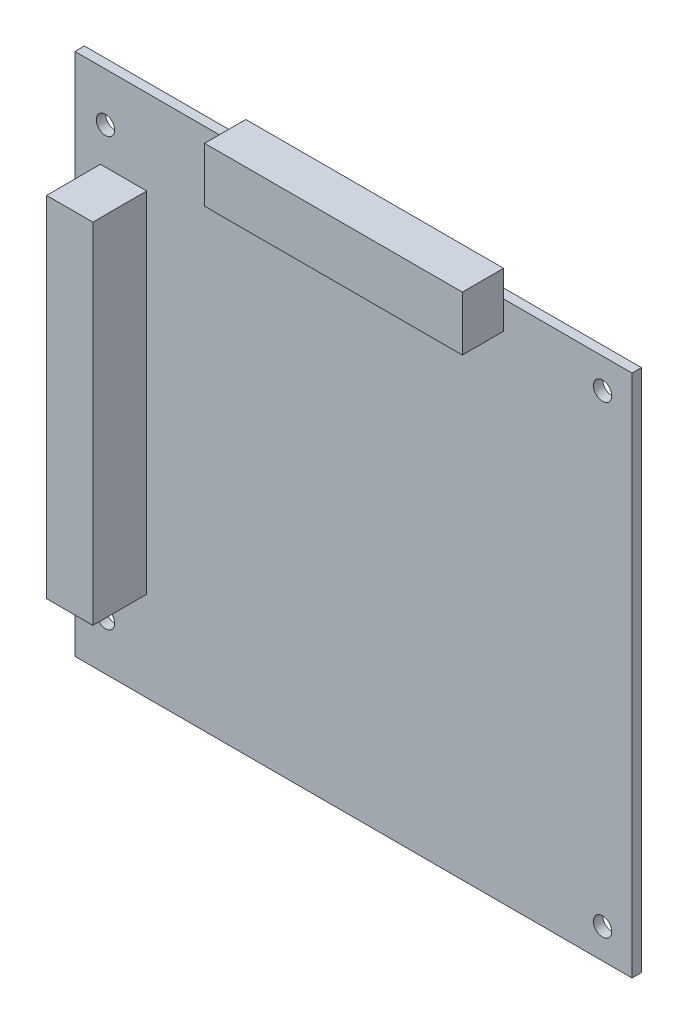
ISO-10303-21;
HEADER;
FILE_DESCRIPTION(('STEP AP214'),'2;1');
FILE_NAME('part.step','',(''),(''),'','','');
FILE_SCHEMA(('AUTOMOTIVE_DESIGN { 1 0 10303 214 1 1 1 1 }'));
ENDSEC;
DATA;
#1=APPLICATION_CONTEXT('core data for automotive mechanical design processes');
#2=APPLICATION_PROTOCOL_DEFINITION('international standard','automotive_design',2000,#1);
#3=PRODUCT_CONTEXT('',#1,'mechanical');
#4=PRODUCT('Part','Part','',(#3));
#5=PRODUCT_RELATED_PRODUCT_CATEGORY('part','',(#4));
#6=PRODUCT_DEFINITION_FORMATION('','',#4);
#7=PRODUCT_DEFINITION_CONTEXT('part definition',#1,'design');
#8=PRODUCT_DEFINITION('design','',#6,#7);
#9=PRODUCT_DEFINITION_SHAPE('','',#8);
#10=(LENGTH_UNIT() NAMED_UNIT(*) SI_UNIT(.MILLI.,.METRE.));
#11=(NAMED_UNIT(*) PLANE_ANGLE_UNIT() SI_UNIT($,.RADIAN.));
#12=(NAMED_UNIT(*) SI_UNIT($,.STERADIAN.) SOLID_ANGLE_UNIT());
#13=UNCERTAINTY_MEASURE_WITH_UNIT(LENGTH_MEASURE(1.E-05),#10,'distance_accuracy_value','');
#14=(GEOMETRIC_REPRESENTATION_CONTEXT(3) GLOBAL_UNCERTAINTY_ASSIGNED_CONTEXT((#13)) GLOBAL_UNIT_ASSIGNED_CONTEXT((#10,
#11,#12)) REPRESENTATION_CONTEXT('',''));
#15=CARTESIAN_POINT('',(0.,0.,0.));
#16=DIRECTION('',(0.,0.,1.));
#17=DIRECTION('',(1.,0.,0.));
#18=AXIS2_PLACEMENT_3D('',#15,#16,#17);
#19=CARTESIAN_POINT('',(48.0314,45.1739,1.6256));
#20=DIRECTION('',(0.,0.,-1.));
#21=DIRECTION('',(-1.,0.,0.));
#22=AXIS2_PLACEMENT_3D('',#19,#20,#21);
#23=PLANE('',#22);
#24=CARTESIAN_POINT('',(-42.7736,36.83,1.6256));
#25=DIRECTION('',(0.,0.,1.));
#26=DIRECTION('',(1.,0.,0.));
#27=AXIS2_PLACEMENT_3D('',#24,#25,#26);
#28=CIRCLE('',#27,1.5875);
#29=CARTESIAN_POINT('',(-41.1861,36.83,1.6256));
#30=VERTEX_POINT('',#29);
#31=EDGE_CURVE('E252',#30,#30,#28,.T.);
#32=ORIENTED_EDGE('',*,*,#31,.F.);
#33=EDGE_LOOP('',(#32));
#34=FACE_BOUND('',#33,.T.);
#35=CARTESIAN_POINT('',(42.9514,40.005,1.6256));
#36=DIRECTION('',(0.,0.,1.));
#37=DIRECTION('',(1.,0.,0.));
#38=AXIS2_PLACEMENT_3D('',#35,#36,#37);
#39=CIRCLE('',#38,1.5875);
#40=CARTESIAN_POINT('',(44.5389,40.005,1.6256));
#41=VERTEX_POINT('',#40);
#42=EDGE_CURVE('E246',#41,#41,#39,.T.);
#43=ORIENTED_EDGE('',*,*,#42,.F.);
#44=EDGE_LOOP('',(#43));
#45=FACE_BOUND('',#44,.T.);
#46=CARTESIAN_POINT('',(42.9514,-40.005,1.6256));
#47=DIRECTION('',(0.,0.,1.));
#48=DIRECTION('',(1.,0.,0.));
#49=AXIS2_PLACEMENT_3D('',#46,#47,#48);
#50=CIRCLE('',#49,1.5875);
#51=CARTESIAN_POINT('',(44.5389,-40.005,1.6256));
#52=VERTEX_POINT('',#51);
#53=EDGE_CURVE('E240',#52,#52,#50,.T.);
#54=ORIENTED_EDGE('',*,*,#53,.F.);
#55=EDGE_LOOP('',(#54));
#56=FACE_BOUND('',#55,.T.);
#57=CARTESIAN_POINT('',(-42.7736,-36.83,1.6256));
#58=DIRECTION('',(0.,0.,1.));
#59=DIRECTION('',(1.,0.,0.));
#60=AXIS2_PLACEMENT_3D('',#57,#58,#59);
#61=CIRCLE('',#60,1.5875);
#62=CARTESIAN_POINT('',(-41.1861,-36.83,1.6256));
#63=VERTEX_POINT('',#62);
#64=EDGE_CURVE('E236',#63,#63,#61,.T.);
#65=ORIENTED_EDGE('',*,*,#64,.F.);
#66=EDGE_LOOP('',(#65));
#67=FACE_BOUND('',#66,.T.);
#68=DIRECTION('',(0.,-1.,0.));
#69=VECTOR('',#68,1.);
#70=CARTESIAN_POINT('',(-35.6616,45.1739,1.6256));
#71=LINE('',#70,#69);
#72=CARTESIAN_POINT('',(-35.6616,30.5181,1.6256));
#73=VERTEX_POINT('',#72);
#74=CARTESIAN_POINT('',(-35.6616,-29.7053,1.6256));
#75=VERTEX_POINT('',#74);
#76=EDGE_CURVE('E230',#73,#75,#71,.T.);
#77=ORIENTED_EDGE('',*,*,#76,.T.);
#78=DIRECTION('',(-1.,0.,0.));
#79=VECTOR('',#78,1.);
#80=CARTESIAN_POINT('',(48.0314,-29.7053,1.6256));
#81=LINE('',#80,#79);
#82=CARTESIAN_POINT('',(-43.6372,-29.7053,1.6256));
#83=VERTEX_POINT('',#82);
#84=EDGE_CURVE('E233',#75,#83,#81,.T.);
#85=ORIENTED_EDGE('',*,*,#84,.T.);
#86=DIRECTION('',(0.,1.,0.));
#87=VECTOR('',#86,1.);
#88=CARTESIAN_POINT('',(-43.6372,45.1739,1.6256));
#89=LINE('',#88,#87);
#90=CARTESIAN_POINT('',(-43.6372,30.5181,1.6256));
#91=VERTEX_POINT('',#90);
#92=EDGE_CURVE('E224',#83,#91,#89,.T.);
#93=ORIENTED_EDGE('',*,*,#92,.T.);
#94=DIRECTION('',(1.,0.,0.));
#95=VECTOR('',#94,1.);
#96=CARTESIAN_POINT('',(48.0314,30.5181,1.6256));
#97=LINE('',#96,#95);
#98=EDGE_CURVE('E227',#91,#73,#97,.T.);
#99=ORIENTED_EDGE('',*,*,#98,.T.);
#100=EDGE_LOOP('',(#77,#85,#93,#99));
#101=FACE_BOUND('',#100,.T.);
#102=DIRECTION('',(0.,-1.,0.));
#103=VECTOR('',#102,1.);
#104=CARTESIAN_POINT('',(-18.5674,45.1739,1.6256));
#105=LINE('',#104,#103);
#106=CARTESIAN_POINT('',(-18.5674,45.1739,1.6256));
#107=VERTEX_POINT('',#106);
#108=CARTESIAN_POINT('',(-18.5674,40.3479,1.6256));
#109=VERTEX_POINT('',#108);
#110=EDGE_CURVE('E12',#107,#109,#105,.T.);
#111=ORIENTED_EDGE('',*,*,#110,.F.);
#112=DIRECTION('',(-1.,0.,0.));
#113=VECTOR('',#112,1.);
#114=CARTESIAN_POINT('',(-48.0314,45.1739,1.6256));
#115=LINE('',#114,#113);
#116=CARTESIAN_POINT('',(-48.0314,45.1739,1.6256));
#117=VERTEX_POINT('',#116);
#118=EDGE_CURVE('E264',#107,#117,#115,.T.);
#119=ORIENTED_EDGE('',*,*,#118,.T.);
#120=DIRECTION('',(0.,-1.,0.));
#121=VECTOR('',#120,1.);
#122=CARTESIAN_POINT('',(-48.0314,-45.1739,1.6256));
#123=LINE('',#122,#121);
#124=CARTESIAN_POINT('',(-48.0314,-45.1739,1.6256));
#125=VERTEX_POINT('',#124);
#126=EDGE_CURVE('E268',#117,#125,#123,.T.);
#127=ORIENTED_EDGE('',*,*,#126,.T.);
#128=DIRECTION('',(1.,0.,0.));
#129=VECTOR('',#128,1.);
#130=CARTESIAN_POINT('',(-48.0314,-45.1739,1.6256));
#131=LINE('',#130,#129);
#132=CARTESIAN_POINT('',(48.0314,-45.1739,1.6256));
#133=VERTEX_POINT('',#132);
#134=EDGE_CURVE('E271',#125,#133,#131,.T.);
#135=ORIENTED_EDGE('',*,*,#134,.T.);
#136=DIRECTION('',(0.,1.,0.));
#137=VECTOR('',#136,1.);
#138=CARTESIAN_POINT('',(48.0314,-45.1739,1.6256));
#139=LINE('',#138,#137);
#140=CARTESIAN_POINT('',(48.0314,45.1739,1.6256));
#141=VERTEX_POINT('',#140);
#142=EDGE_CURVE('E261',#133,#141,#139,.T.);
#143=ORIENTED_EDGE('',*,*,#142,.T.);
#144=CARTESIAN_POINT('',(25.8826,45.1739,1.6256));
#145=VERTEX_POINT('',#144);
#146=EDGE_CURVE('E266',#141,#145,#115,.T.);
#147=ORIENTED_EDGE('',*,*,#146,.T.);
#148=DIRECTION('',(0.,1.,0.));
#149=VECTOR('',#148,1.);
#150=CARTESIAN_POINT('',(25.8826,40.3479,1.6256));
#151=LINE('',#150,#149);
#152=CARTESIAN_POINT('',(25.8826,40.3479,1.6256));
#153=VERTEX_POINT('',#152);
#154=EDGE_CURVE('E59',#153,#145,#151,.T.);
#155=ORIENTED_EDGE('',*,*,#154,.F.);
#156=DIRECTION('',(1.,0.,0.));
#157=VECTOR('',#156,1.);
#158=CARTESIAN_POINT('',(-18.5674,40.3479,1.6256));
#159=LINE('',#158,#157);
#160=EDGE_CURVE('E55',#109,#153,#159,.T.);
#161=ORIENTED_EDGE('',*,*,#160,.F.);
#162=EDGE_LOOP('',(#111,#119,#127,#135,#143,#147,#155,#161));
#163=FACE_BOUND('',#162,.T.);
#164=ADVANCED_FACE('F40',(#34,#45,#56,#67,#101,#163),#23,.F.);
#165=CARTESIAN_POINT('',(48.0314,-45.1739,1.6256));
#166=DIRECTION('',(-1.,0.,0.));
#167=DIRECTION('',(0.,0.,1.));
#168=AXIS2_PLACEMENT_3D('',#165,#166,#167);
#169=PLANE('',#168);
#170=DIRECTION('',(0.,1.,0.));
#171=VECTOR('',#170,1.);
#172=CARTESIAN_POINT('',(48.0314,-45.1739,0.));
#173=LINE('',#172,#171);
#174=CARTESIAN_POINT('',(48.0314,-45.1739,0.));
#175=VERTEX_POINT('',#174);
#176=CARTESIAN_POINT('',(48.0314,45.1739,0.));
#177=VERTEX_POINT('',#176);
#178=EDGE_CURVE('E258',#175,#177,#173,.T.);
#179=ORIENTED_EDGE('',*,*,#178,.T.);
#180=DIRECTION('',(0.,0.,-1.));
#181=VECTOR('',#180,1.);
#182=CARTESIAN_POINT('',(48.0314,45.1739,1.6256));
#183=LINE('',#182,#181);
#184=EDGE_CURVE('E289',#141,#177,#183,.T.);
#185=ORIENTED_EDGE('',*,*,#184,.F.);
#186=ORIENTED_EDGE('',*,*,#142,.F.);
#187=DIRECTION('',(0.,0.,-1.));
#188=VECTOR('',#187,1.);
#189=CARTESIAN_POINT('',(48.0314,-45.1739,1.6256));
#190=LINE('',#189,#188);
#191=EDGE_CURVE('E273',#133,#175,#190,.T.);
#192=ORIENTED_EDGE('',*,*,#191,.T.);
#193=EDGE_LOOP('',(#179,#185,#186,#192));
#194=FACE_BOUND('',#193,.T.);
#195=ADVANCED_FACE('F42',(#194),#169,.F.);
#196=CARTESIAN_POINT('',(-48.0314,45.1739,1.6256));
#197=DIRECTION('',(0.,-1.,0.));
#198=DIRECTION('',(0.,0.,-1.));
#199=AXIS2_PLACEMENT_3D('',#196,#197,#198);
#200=PLANE('',#199);
#201=DIRECTION('',(-1.,0.,0.));
#202=VECTOR('',#201,1.);
#203=CARTESIAN_POINT('',(-48.0314,45.1739,0.));
#204=LINE('',#203,#202);
#205=CARTESIAN_POINT('',(-48.0314,45.1739,0.));
#206=VERTEX_POINT('',#205);
#207=EDGE_CURVE('E276',#177,#206,#204,.T.);
#208=ORIENTED_EDGE('',*,*,#207,.T.);
#209=DIRECTION('',(0.,0.,-1.));
#210=VECTOR('',#209,1.);
#211=CARTESIAN_POINT('',(-48.0314,45.1739,1.6256));
#212=LINE('',#211,#210);
#213=EDGE_CURVE('E286',#117,#206,#212,.T.);
#214=ORIENTED_EDGE('',*,*,#213,.F.);
#215=ORIENTED_EDGE('',*,*,#118,.F.);
#216=EDGE_CURVE('E269',#145,#107,#115,.T.);
#217=ORIENTED_EDGE('',*,*,#216,.F.);
#218=ORIENTED_EDGE('',*,*,#146,.F.);
#219=ORIENTED_EDGE('',*,*,#184,.T.);
#220=EDGE_LOOP('',(#208,#214,#215,#217,#218,#219));
#221=FACE_BOUND('',#220,.T.);
#222=ADVANCED_FACE('F337',(#221),#200,.F.);
#223=CARTESIAN_POINT('',(-48.0314,-45.1739,1.6256));
#224=DIRECTION('',(1.,0.,0.));
#225=DIRECTION('',(0.,0.,-1.));
#226=AXIS2_PLACEMENT_3D('',#223,#224,#225);
#227=PLANE('',#226);
#228=DIRECTION('',(0.,-1.,0.));
#229=VECTOR('',#228,1.);
#230=CARTESIAN_POINT('',(-48.0314,-45.1739,0.));
#231=LINE('',#230,#229);
#232=CARTESIAN_POINT('',(-48.0314,-45.1739,0.));
#233=VERTEX_POINT('',#232);
#234=EDGE_CURVE('E278',#206,#233,#231,.T.);
#235=ORIENTED_EDGE('',*,*,#234,.T.);
#236=DIRECTION('',(0.,0.,-1.));
#237=VECTOR('',#236,1.);
#238=CARTESIAN_POINT('',(-48.0314,-45.1739,1.6256));
#239=LINE('',#238,#237);
#240=EDGE_CURVE('E283',#125,#233,#239,.T.);
#241=ORIENTED_EDGE('',*,*,#240,.F.);
#242=ORIENTED_EDGE('',*,*,#126,.F.);
#243=ORIENTED_EDGE('',*,*,#213,.T.);
#244=EDGE_LOOP('',(#235,#241,#242,#243));
#245=FACE_BOUND('',#244,.T.);
#246=ADVANCED_FACE('F350',(#245),#227,.F.);
#247=CARTESIAN_POINT('',(-48.0314,-45.1739,1.6256));
#248=DIRECTION('',(0.,1.,0.));
#249=DIRECTION('',(0.,0.,1.));
#250=AXIS2_PLACEMENT_3D('',#247,#248,#249);
#251=PLANE('',#250);
#252=DIRECTION('',(1.,0.,0.));
#253=VECTOR('',#252,1.);
#254=CARTESIAN_POINT('',(-48.0314,-45.1739,0.));
#255=LINE('',#254,#253);
#256=EDGE_CURVE('E265',#233,#175,#255,.T.);
#257=ORIENTED_EDGE('',*,*,#256,.T.);
#258=ORIENTED_EDGE('',*,*,#191,.F.);
#259=ORIENTED_EDGE('',*,*,#134,.F.);
#260=ORIENTED_EDGE('',*,*,#240,.T.);
#261=EDGE_LOOP('',(#257,#258,#259,#260));
#262=FACE_BOUND('',#261,.T.);
#263=ADVANCED_FACE('F347',(#262),#251,.F.);
#264=CARTESIAN_POINT('',(48.0314,45.1739,0.));
#265=DIRECTION('',(0.,0.,-1.));
#266=DIRECTION('',(-1.,0.,0.));
#267=AXIS2_PLACEMENT_3D('',#264,#265,#266);
#268=PLANE('',#267);
#269=DIRECTION('',(-1.,0.,0.));
#270=VECTOR('',#269,1.);
#271=CARTESIAN_POINT('',(48.0314,-29.7053,0.));
#272=LINE('',#271,#270);
#273=CARTESIAN_POINT('',(-35.6616,-29.7053,0.));
#274=VERTEX_POINT('',#273);
#275=CARTESIAN_POINT('',(-43.6372,-29.7053,0.));
#276=VERTEX_POINT('',#275);
#277=EDGE_CURVE('E48',#274,#276,#272,.T.);
#278=ORIENTED_EDGE('',*,*,#277,.F.);
#279=DIRECTION('',(0.,-1.,0.));
#280=VECTOR('',#279,1.);
#281=CARTESIAN_POINT('',(-35.6616,45.1739,0.));
#282=LINE('',#281,#280);
#283=CARTESIAN_POINT('',(-35.6616,30.5181,0.));
#284=VERTEX_POINT('',#283);
#285=EDGE_CURVE('E298',#284,#274,#282,.T.);
#286=ORIENTED_EDGE('',*,*,#285,.F.);
#287=DIRECTION('',(1.,0.,0.));
#288=VECTOR('',#287,1.);
#289=CARTESIAN_POINT('',(48.0314,30.5181,0.));
#290=LINE('',#289,#288);
#291=CARTESIAN_POINT('',(-43.6372,30.5181,0.));
#292=VERTEX_POINT('',#291);
#293=EDGE_CURVE('E295',#292,#284,#290,.T.);
#294=ORIENTED_EDGE('',*,*,#293,.F.);
#295=DIRECTION('',(0.,1.,0.));
#296=VECTOR('',#295,1.);
#297=CARTESIAN_POINT('',(-43.6372,45.1739,0.));
#298=LINE('',#297,#296);
#299=EDGE_CURVE('E292',#276,#292,#298,.T.);
#300=ORIENTED_EDGE('',*,*,#299,.F.);
#301=EDGE_LOOP('',(#278,#286,#294,#300));
#302=FACE_BOUND('',#301,.T.);
#303=CARTESIAN_POINT('',(-42.7736,-36.83,0.));
#304=DIRECTION('',(0.,0.,1.));
#305=DIRECTION('',(1.,0.,0.));
#306=AXIS2_PLACEMENT_3D('',#303,#304,#305);
#307=CIRCLE('',#306,1.5875);
#308=CARTESIAN_POINT('',(-41.1861,-36.83,0.));
#309=VERTEX_POINT('',#308);
#310=EDGE_CURVE('E237',#309,#309,#307,.T.);
#311=ORIENTED_EDGE('',*,*,#310,.T.);
#312=EDGE_LOOP('',(#311));
#313=FACE_BOUND('',#312,.T.);
#314=CARTESIAN_POINT('',(42.9514,-40.005,0.));
#315=DIRECTION('',(0.,0.,1.));
#316=DIRECTION('',(1.,0.,0.));
#317=AXIS2_PLACEMENT_3D('',#314,#315,#316);
#318=CIRCLE('',#317,1.5875);
#319=CARTESIAN_POINT('',(44.5389,-40.005,0.));
#320=VERTEX_POINT('',#319);
#321=EDGE_CURVE('E243',#320,#320,#318,.T.);
#322=ORIENTED_EDGE('',*,*,#321,.T.);
#323=EDGE_LOOP('',(#322));
#324=FACE_BOUND('',#323,.T.);
#325=CARTESIAN_POINT('',(42.9514,40.005,0.));
#326=DIRECTION('',(0.,0.,1.));
#327=DIRECTION('',(1.,0.,0.));
#328=AXIS2_PLACEMENT_3D('',#325,#326,#327);
#329=CIRCLE('',#328,1.5875);
#330=CARTESIAN_POINT('',(44.5389,40.005,0.));
#331=VERTEX_POINT('',#330);
#332=EDGE_CURVE('E249',#331,#331,#329,.T.);
#333=ORIENTED_EDGE('',*,*,#332,.T.);
#334=EDGE_LOOP('',(#333));
#335=FACE_BOUND('',#334,.T.);
#336=CARTESIAN_POINT('',(-42.7736,36.83,0.));
#337=DIRECTION('',(0.,0.,1.));
#338=DIRECTION('',(1.,0.,0.));
#339=AXIS2_PLACEMENT_3D('',#336,#337,#338);
#340=CIRCLE('',#339,1.5875);
#341=CARTESIAN_POINT('',(-41.1861,36.83,0.));
#342=VERTEX_POINT('',#341);
#343=EDGE_CURVE('E255',#342,#342,#340,.T.);
#344=ORIENTED_EDGE('',*,*,#343,.T.);
#345=EDGE_LOOP('',(#344));
#346=FACE_BOUND('',#345,.T.);
#347=ORIENTED_EDGE('',*,*,#178,.F.);
#348=ORIENTED_EDGE('',*,*,#256,.F.);
#349=ORIENTED_EDGE('',*,*,#234,.F.);
#350=ORIENTED_EDGE('',*,*,#207,.F.);
#351=EDGE_LOOP('',(#347,#348,#349,#350));
#352=FACE_BOUND('',#351,.T.);
#353=ADVANCED_FACE('F314',(#302,#313,#324,#335,#346,#352),#268,.T.);
#354=CARTESIAN_POINT('',(-42.7736,36.83,0.));
#355=DIRECTION('',(0.,0.,1.));
#356=DIRECTION('',(1.,0.,0.));
#357=AXIS2_PLACEMENT_3D('',#354,#355,#356);
#358=CYLINDRICAL_SURFACE('',#357,1.5875);
#359=ORIENTED_EDGE('',*,*,#343,.F.);
#360=EDGE_LOOP('',(#359));
#361=FACE_BOUND('',#360,.T.);
#362=ORIENTED_EDGE('',*,*,#31,.T.);
#363=EDGE_LOOP('',(#362));
#364=FACE_BOUND('',#363,.T.);
#365=ADVANCED_FACE('F343',(#361,#364),#358,.F.);
#366=CARTESIAN_POINT('',(42.9514,40.005,0.));
#367=DIRECTION('',(0.,0.,1.));
#368=DIRECTION('',(1.,0.,0.));
#369=AXIS2_PLACEMENT_3D('',#366,#367,#368);
#370=CYLINDRICAL_SURFACE('',#369,1.5875);
#371=ORIENTED_EDGE('',*,*,#332,.F.);
#372=EDGE_LOOP('',(#371));
#373=FACE_BOUND('',#372,.T.);
#374=ORIENTED_EDGE('',*,*,#42,.T.);
#375=EDGE_LOOP('',(#374));
#376=FACE_BOUND('',#375,.T.);
#377=ADVANCED_FACE('F442',(#373,#376),#370,.F.);
#378=CARTESIAN_POINT('',(42.9514,-40.005,0.));
#379=DIRECTION('',(0.,0.,1.));
#380=DIRECTION('',(1.,0.,0.));
#381=AXIS2_PLACEMENT_3D('',#378,#379,#380);
#382=CYLINDRICAL_SURFACE('',#381,1.5875);
#383=ORIENTED_EDGE('',*,*,#321,.F.);
#384=EDGE_LOOP('',(#383));
#385=FACE_BOUND('',#384,.T.);
#386=ORIENTED_EDGE('',*,*,#53,.T.);
#387=EDGE_LOOP('',(#386));
#388=FACE_BOUND('',#387,.T.);
#389=ADVANCED_FACE('F439',(#385,#388),#382,.F.);
#390=CARTESIAN_POINT('',(-42.7736,-36.83,0.));
#391=DIRECTION('',(0.,0.,1.));
#392=DIRECTION('',(1.,0.,0.));
#393=AXIS2_PLACEMENT_3D('',#390,#391,#392);
#394=CYLINDRICAL_SURFACE('',#393,1.5875);
#395=ORIENTED_EDGE('',*,*,#310,.F.);
#396=EDGE_LOOP('',(#395));
#397=FACE_BOUND('',#396,.T.);
#398=ORIENTED_EDGE('',*,*,#64,.T.);
#399=EDGE_LOOP('',(#398));
#400=FACE_BOUND('',#399,.T.);
#401=ADVANCED_FACE('F436',(#397,#400),#394,.F.);
#402=CARTESIAN_POINT('',(48.0314,45.1739,-10.9982));
#403=DIRECTION('',(0.,0.,-1.));
#404=DIRECTION('',(-1.,0.,0.));
#405=AXIS2_PLACEMENT_3D('',#402,#403,#404);
#406=PLANE('',#405);
#407=DIRECTION('',(0.,-1.,0.));
#408=VECTOR('',#407,1.);
#409=CARTESIAN_POINT('',(-43.6372,30.5181,-10.9982));
#410=LINE('',#409,#408);
#411=CARTESIAN_POINT('',(-43.6372,30.5181,-10.9982));
#412=VERTEX_POINT('',#411);
#413=CARTESIAN_POINT('',(-43.6372,-29.7053,-10.9982));
#414=VERTEX_POINT('',#413);
#415=EDGE_CURVE('E200',#412,#414,#410,.T.);
#416=ORIENTED_EDGE('',*,*,#415,.F.);
#417=DIRECTION('',(-1.,0.,0.));
#418=VECTOR('',#417,1.);
#419=CARTESIAN_POINT('',(-43.6372,30.5181,-10.9982));
#420=LINE('',#419,#418);
#421=CARTESIAN_POINT('',(-35.6616,30.5181,-10.9982));
#422=VERTEX_POINT('',#421);
#423=EDGE_CURVE('E205',#422,#412,#420,.T.);
#424=ORIENTED_EDGE('',*,*,#423,.F.);
#425=DIRECTION('',(0.,1.,0.));
#426=VECTOR('',#425,1.);
#427=CARTESIAN_POINT('',(-35.6616,30.5181,-10.9982));
#428=LINE('',#427,#426);
#429=CARTESIAN_POINT('',(-35.6616,-29.7053,-10.9982));
#430=VERTEX_POINT('',#429);
#431=EDGE_CURVE('E210',#430,#422,#428,.T.);
#432=ORIENTED_EDGE('',*,*,#431,.F.);
#433=DIRECTION('',(1.,0.,0.));
#434=VECTOR('',#433,1.);
#435=CARTESIAN_POINT('',(-43.6372,-29.7053,-10.9982));
#436=LINE('',#435,#434);
#437=EDGE_CURVE('E196',#414,#430,#436,.T.);
#438=ORIENTED_EDGE('',*,*,#437,.F.);
#439=EDGE_LOOP('',(#416,#424,#432,#438));
#440=FACE_BOUND('',#439,.T.);
#441=ADVANCED_FACE('F310',(#440),#406,.T.);
#442=CARTESIAN_POINT('',(-43.6372,30.5181,-82.7456230643323));
#443=DIRECTION('',(-1.,0.,0.));
#444=DIRECTION('',(0.,-1.,0.));
#445=AXIS2_PLACEMENT_3D('',#442,#443,#444);
#446=PLANE('',#445);
#447=DIRECTION('',(0.,0.,1.));
#448=VECTOR('',#447,1.);
#449=CARTESIAN_POINT('',(-43.6372,-29.7053,-82.7456230643323));
#450=LINE('',#449,#448);
#451=EDGE_CURVE('E221',#414,#276,#450,.T.);
#452=ORIENTED_EDGE('',*,*,#451,.T.);
#453=ORIENTED_EDGE('',*,*,#299,.T.);
#454=DIRECTION('',(0.,0.,1.));
#455=VECTOR('',#454,1.);
#456=CARTESIAN_POINT('',(-43.6372,30.5181,-82.7456230643323));
#457=LINE('',#456,#455);
#458=EDGE_CURVE('E204',#412,#292,#457,.T.);
#459=ORIENTED_EDGE('',*,*,#458,.F.);
#460=ORIENTED_EDGE('',*,*,#415,.T.);
#461=EDGE_LOOP('',(#452,#453,#459,#460));
#462=FACE_BOUND('',#461,.T.);
#463=ADVANCED_FACE('F307',(#462),#446,.T.);
#464=CARTESIAN_POINT('',(-43.6372,30.5181,-82.7456230643323));
#465=DIRECTION('',(0.,1.,0.));
#466=DIRECTION('',(0.,0.,1.));
#467=AXIS2_PLACEMENT_3D('',#464,#465,#466);
#468=PLANE('',#467);
#469=ORIENTED_EDGE('',*,*,#458,.T.);
#470=ORIENTED_EDGE('',*,*,#293,.T.);
#471=DIRECTION('',(0.,0.,1.));
#472=VECTOR('',#471,1.);
#473=CARTESIAN_POINT('',(-35.6616,30.5181,-82.7456230643323));
#474=LINE('',#473,#472);
#475=EDGE_CURVE('E209',#422,#284,#474,.T.);
#476=ORIENTED_EDGE('',*,*,#475,.F.);
#477=ORIENTED_EDGE('',*,*,#423,.T.);
#478=EDGE_LOOP('',(#469,#470,#476,#477));
#479=FACE_BOUND('',#478,.T.);
#480=ADVANCED_FACE('F317',(#479),#468,.T.);
#481=CARTESIAN_POINT('',(-35.6616,30.5181,-82.7456230643323));
#482=DIRECTION('',(1.,0.,0.));
#483=DIRECTION('',(0.,1.,0.));
#484=AXIS2_PLACEMENT_3D('',#481,#482,#483);
#485=PLANE('',#484);
#486=ORIENTED_EDGE('',*,*,#475,.T.);
#487=ORIENTED_EDGE('',*,*,#285,.T.);
#488=DIRECTION('',(0.,0.,1.));
#489=VECTOR('',#488,1.);
#490=CARTESIAN_POINT('',(-35.6616,-29.7053,-82.7456230643323));
#491=LINE('',#490,#489);
#492=EDGE_CURVE('E214',#430,#274,#491,.T.);
#493=ORIENTED_EDGE('',*,*,#492,.F.);
#494=ORIENTED_EDGE('',*,*,#431,.T.);
#495=EDGE_LOOP('',(#486,#487,#493,#494));
#496=FACE_BOUND('',#495,.T.);
#497=ADVANCED_FACE('F313',(#496),#485,.T.);
#498=CARTESIAN_POINT('',(-43.6372,-29.7053,-82.7456230643323));
#499=DIRECTION('',(0.,-1.,0.));
#500=DIRECTION('',(1.,0.,0.));
#501=AXIS2_PLACEMENT_3D('',#498,#499,#500);
#502=PLANE('',#501);
#503=ORIENTED_EDGE('',*,*,#492,.T.);
#504=ORIENTED_EDGE('',*,*,#277,.T.);
#505=ORIENTED_EDGE('',*,*,#451,.F.);
#506=ORIENTED_EDGE('',*,*,#437,.T.);
#507=EDGE_LOOP('',(#503,#504,#505,#506));
#508=FACE_BOUND('',#507,.T.);
#509=ADVANCED_FACE('F303',(#508),#502,.T.);
#510=ORIENTED_EDGE('',*,*,#84,.F.);
#511=CARTESIAN_POINT('',(-35.6616,-29.7053,10.922));
#512=VERTEX_POINT('',#511);
#513=EDGE_CURVE('E199',#75,#512,#491,.T.);
#514=ORIENTED_EDGE('',*,*,#513,.T.);
#515=DIRECTION('',(1.,0.,0.));
#516=VECTOR('',#515,1.);
#517=CARTESIAN_POINT('',(-43.6372,-29.7053,10.922));
#518=LINE('',#517,#516);
#519=CARTESIAN_POINT('',(-43.6372,-29.7053,10.922));
#520=VERTEX_POINT('',#519);
#521=EDGE_CURVE('E182',#520,#512,#518,.T.);
#522=ORIENTED_EDGE('',*,*,#521,.F.);
#523=EDGE_CURVE('E203',#83,#520,#450,.T.);
#524=ORIENTED_EDGE('',*,*,#523,.F.);
#525=EDGE_LOOP('',(#510,#514,#522,#524));
#526=FACE_BOUND('',#525,.T.);
#527=ADVANCED_FACE('F422',(#526),#502,.T.);
#528=ORIENTED_EDGE('',*,*,#76,.F.);
#529=CARTESIAN_POINT('',(-35.6616,30.5181,10.922));
#530=VERTEX_POINT('',#529);
#531=EDGE_CURVE('E213',#73,#530,#474,.T.);
#532=ORIENTED_EDGE('',*,*,#531,.T.);
#533=DIRECTION('',(0.,1.,0.));
#534=VECTOR('',#533,1.);
#535=CARTESIAN_POINT('',(-35.6616,30.5181,10.922));
#536=LINE('',#535,#534);
#537=EDGE_CURVE('E190',#512,#530,#536,.T.);
#538=ORIENTED_EDGE('',*,*,#537,.F.);
#539=ORIENTED_EDGE('',*,*,#513,.F.);
#540=EDGE_LOOP('',(#528,#532,#538,#539));
#541=FACE_BOUND('',#540,.T.);
#542=ADVANCED_FACE('F326',(#541),#485,.T.);
#543=ORIENTED_EDGE('',*,*,#98,.F.);
#544=CARTESIAN_POINT('',(-43.6372,30.5181,10.922));
#545=VERTEX_POINT('',#544);
#546=EDGE_CURVE('E208',#91,#545,#457,.T.);
#547=ORIENTED_EDGE('',*,*,#546,.T.);
#548=DIRECTION('',(-1.,0.,0.));
#549=VECTOR('',#548,1.);
#550=CARTESIAN_POINT('',(-43.6372,30.5181,10.922));
#551=LINE('',#550,#549);
#552=EDGE_CURVE('E193',#530,#545,#551,.T.);
#553=ORIENTED_EDGE('',*,*,#552,.F.);
#554=ORIENTED_EDGE('',*,*,#531,.F.);
#555=EDGE_LOOP('',(#543,#547,#553,#554));
#556=FACE_BOUND('',#555,.T.);
#557=ADVANCED_FACE('F320',(#556),#468,.T.);
#558=ORIENTED_EDGE('',*,*,#92,.F.);
#559=ORIENTED_EDGE('',*,*,#523,.T.);
#560=DIRECTION('',(0.,-1.,0.));
#561=VECTOR('',#560,1.);
#562=CARTESIAN_POINT('',(-43.6372,30.5181,10.922));
#563=LINE('',#562,#561);
#564=EDGE_CURVE('E179',#545,#520,#563,.T.);
#565=ORIENTED_EDGE('',*,*,#564,.F.);
#566=ORIENTED_EDGE('',*,*,#546,.F.);
#567=EDGE_LOOP('',(#558,#559,#565,#566));
#568=FACE_BOUND('',#567,.T.);
#569=ADVANCED_FACE('F328',(#568),#446,.T.);
#570=CARTESIAN_POINT('',(-43.6372,-29.7053,10.922));
#571=DIRECTION('',(0.,0.,1.));
#572=DIRECTION('',(1.,0.,0.));
#573=AXIS2_PLACEMENT_3D('',#570,#571,#572);
#574=PLANE('',#573);
#575=ORIENTED_EDGE('',*,*,#564,.T.);
#576=ORIENTED_EDGE('',*,*,#521,.T.);
#577=ORIENTED_EDGE('',*,*,#537,.T.);
#578=ORIENTED_EDGE('',*,*,#552,.T.);
#579=EDGE_LOOP('',(#575,#576,#577,#578));
#580=FACE_BOUND('',#579,.T.);
#581=ADVANCED_FACE('F407',(#580),#574,.T.);
#582=CARTESIAN_POINT('',(-18.5674,49.7459,1.6256));
#583=DIRECTION('',(0.,0.,-1.));
#584=DIRECTION('',(-1.,0.,0.));
#585=AXIS2_PLACEMENT_3D('',#582,#583,#584);
#586=PLANE('',#585);
#587=ORIENTED_EDGE('',*,*,#216,.T.);
#588=DIRECTION('',(0.,-1.,0.));
#589=VECTOR('',#588,1.);
#590=CARTESIAN_POINT('',(-18.5674,40.3479,1.6256));
#591=LINE('',#590,#589);
#592=CARTESIAN_POINT('',(-18.5674,49.7459,1.6256));
#593=VERTEX_POINT('',#592);
#594=EDGE_CURVE('E377',#593,#107,#591,.T.);
#595=ORIENTED_EDGE('',*,*,#594,.F.);
#596=DIRECTION('',(-1.,0.,0.));
#597=VECTOR('',#596,1.);
#598=CARTESIAN_POINT('',(-18.5674,49.7459,1.6256));
#599=LINE('',#598,#597);
#600=CARTESIAN_POINT('',(25.8826,49.7459,1.6256));
#601=VERTEX_POINT('',#600);
#602=EDGE_CURVE('E175',#601,#593,#599,.T.);
#603=ORIENTED_EDGE('',*,*,#602,.F.);
#604=EDGE_CURVE('E378',#145,#601,#151,.T.);
#605=ORIENTED_EDGE('',*,*,#604,.F.);
#606=EDGE_LOOP('',(#587,#595,#603,#605));
#607=FACE_BOUND('',#606,.T.);
#608=ADVANCED_FACE('F375',(#607),#586,.T.);
#609=CARTESIAN_POINT('',(-18.5674,40.3479,8.7376));
#610=DIRECTION('',(1.,0.,0.));
#611=DIRECTION('',(0.,0.,-1.));
#612=AXIS2_PLACEMENT_3D('',#609,#610,#611);
#613=PLANE('',#612);
#614=ORIENTED_EDGE('',*,*,#594,.T.);
#615=ORIENTED_EDGE('',*,*,#110,.T.);
#616=DIRECTION('',(0.,0.,-1.));
#617=VECTOR('',#616,1.);
#618=CARTESIAN_POINT('',(-18.5674,40.3479,8.7376));
#619=LINE('',#618,#617);
#620=CARTESIAN_POINT('',(-18.5674,40.3479,8.7376));
#621=VERTEX_POINT('',#620);
#622=EDGE_CURVE('E160',#621,#109,#619,.T.);
#623=ORIENTED_EDGE('',*,*,#622,.F.);
#624=DIRECTION('',(0.,-1.,0.));
#625=VECTOR('',#624,1.);
#626=CARTESIAN_POINT('',(-18.5674,40.3479,8.7376));
#627=LINE('',#626,#625);
#628=CARTESIAN_POINT('',(-18.5674,49.7459,8.7376));
#629=VERTEX_POINT('',#628);
#630=EDGE_CURVE('E166',#629,#621,#627,.T.);
#631=ORIENTED_EDGE('',*,*,#630,.F.);
#632=DIRECTION('',(0.,0.,-1.));
#633=VECTOR('',#632,1.);
#634=CARTESIAN_POINT('',(-18.5674,49.7459,8.7376));
#635=LINE('',#634,#633);
#636=EDGE_CURVE('E379',#629,#593,#635,.T.);
#637=ORIENTED_EDGE('',*,*,#636,.T.);
#638=EDGE_LOOP('',(#614,#615,#623,#631,#637));
#639=FACE_BOUND('',#638,.T.);
#640=ADVANCED_FACE('F178',(#639),#613,.F.);
#641=CARTESIAN_POINT('',(-18.5674,40.3479,8.7376));
#642=DIRECTION('',(0.,1.,0.));
#643=DIRECTION('',(0.,0.,1.));
#644=AXIS2_PLACEMENT_3D('',#641,#642,#643);
#645=PLANE('',#644);
#646=ORIENTED_EDGE('',*,*,#160,.T.);
#647=DIRECTION('',(0.,0.,-1.));
#648=VECTOR('',#647,1.);
#649=CARTESIAN_POINT('',(25.8826,40.3479,8.7376));
#650=LINE('',#649,#648);
#651=CARTESIAN_POINT('',(25.8826,40.3479,8.7376));
#652=VERTEX_POINT('',#651);
#653=EDGE_CURVE('E162',#652,#153,#650,.T.);
#654=ORIENTED_EDGE('',*,*,#653,.F.);
#655=DIRECTION('',(1.,0.,0.));
#656=VECTOR('',#655,1.);
#657=CARTESIAN_POINT('',(-18.5674,40.3479,8.7376));
#658=LINE('',#657,#656);
#659=EDGE_CURVE('E156',#621,#652,#658,.T.);
#660=ORIENTED_EDGE('',*,*,#659,.F.);
#661=ORIENTED_EDGE('',*,*,#622,.T.);
#662=EDGE_LOOP('',(#646,#654,#660,#661));
#663=FACE_BOUND('',#662,.T.);
#664=ADVANCED_FACE('F158',(#663),#645,.F.);
#665=CARTESIAN_POINT('',(25.8826,40.3479,8.7376));
#666=DIRECTION('',(-1.,0.,0.));
#667=DIRECTION('',(0.,0.,1.));
#668=AXIS2_PLACEMENT_3D('',#665,#666,#667);
#669=PLANE('',#668);
#670=ORIENTED_EDGE('',*,*,#154,.T.);
#671=ORIENTED_EDGE('',*,*,#604,.T.);
#672=DIRECTION('',(0.,0.,-1.));
#673=VECTOR('',#672,1.);
#674=CARTESIAN_POINT('',(25.8826,49.7459,8.7376));
#675=LINE('',#674,#673);
#676=CARTESIAN_POINT('',(25.8826,49.7459,8.7376));
#677=VERTEX_POINT('',#676);
#678=EDGE_CURVE('E184',#677,#601,#675,.T.);
#679=ORIENTED_EDGE('',*,*,#678,.F.);
#680=DIRECTION('',(0.,1.,0.));
#681=VECTOR('',#680,1.);
#682=CARTESIAN_POINT('',(25.8826,40.3479,8.7376));
#683=LINE('',#682,#681);
#684=EDGE_CURVE('E165',#652,#677,#683,.T.);
#685=ORIENTED_EDGE('',*,*,#684,.F.);
#686=ORIENTED_EDGE('',*,*,#653,.T.);
#687=EDGE_LOOP('',(#670,#671,#679,#685,#686));
#688=FACE_BOUND('',#687,.T.);
#689=ADVANCED_FACE('F393',(#688),#669,.F.);
#690=CARTESIAN_POINT('',(-18.5674,49.7459,8.7376));
#691=DIRECTION('',(0.,-1.,0.));
#692=DIRECTION('',(0.,0.,-1.));
#693=AXIS2_PLACEMENT_3D('',#690,#691,#692);
#694=PLANE('',#693);
#695=ORIENTED_EDGE('',*,*,#602,.T.);
#696=ORIENTED_EDGE('',*,*,#636,.F.);
#697=DIRECTION('',(-1.,0.,0.));
#698=VECTOR('',#697,1.);
#699=CARTESIAN_POINT('',(-18.5674,49.7459,8.7376));
#700=LINE('',#699,#698);
#701=EDGE_CURVE('E171',#677,#629,#700,.T.);
#702=ORIENTED_EDGE('',*,*,#701,.F.);
#703=ORIENTED_EDGE('',*,*,#678,.T.);
#704=EDGE_LOOP('',(#695,#696,#702,#703));
#705=FACE_BOUND('',#704,.T.);
#706=ADVANCED_FACE('F391',(#705),#694,.F.);
#707=CARTESIAN_POINT('',(-18.5674,49.7459,8.7376));
#708=DIRECTION('',(0.,0.,-1.));
#709=DIRECTION('',(-1.,0.,0.));
#710=AXIS2_PLACEMENT_3D('',#707,#708,#709);
#711=PLANE('',#710);
#712=ORIENTED_EDGE('',*,*,#630,.T.);
#713=ORIENTED_EDGE('',*,*,#659,.T.);
#714=ORIENTED_EDGE('',*,*,#684,.T.);
#715=ORIENTED_EDGE('',*,*,#701,.T.);
#716=EDGE_LOOP('',(#712,#713,#714,#715));
#717=FACE_BOUND('',#716,.T.);
#718=ADVANCED_FACE('F169',(#717),#711,.F.);
#719=CLOSED_SHELL('',(#164,#195,#222,#246,#263,#353,#365,#377,#389,#401,#441,#463,#480,#497,
#509,#527,#542,#557,#569,#581,#608,#640,#664,#689,#706,#718));
#720=MANIFOLD_SOLID_BREP('B2',#719);
#721=ADVANCED_BREP_SHAPE_REPRESENTATION('',(#18,#720),#14);
#722=SHAPE_DEFINITION_REPRESENTATION(#9,#721);
ENDSEC;
END-ISO-10303-21;
